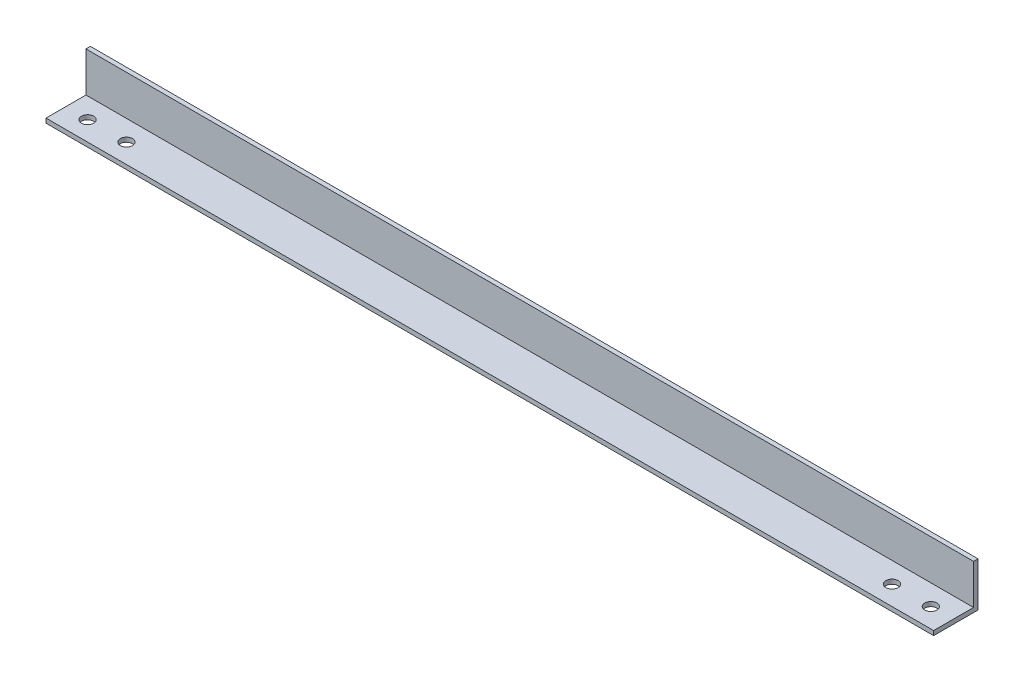
ISO-10303-21;
HEADER;
FILE_DESCRIPTION(('STEP AP214'),'2;1');
FILE_NAME('part.step','',(''),(''),'','','');
FILE_SCHEMA(('AUTOMOTIVE_DESIGN { 1 0 10303 214 1 1 1 1 }'));
ENDSEC;
DATA;
#1=APPLICATION_CONTEXT('core data for automotive mechanical design processes');
#2=APPLICATION_PROTOCOL_DEFINITION('international standard','automotive_design',2000,#1);
#3=PRODUCT_CONTEXT('',#1,'mechanical');
#4=PRODUCT('Part','Part','',(#3));
#5=PRODUCT_RELATED_PRODUCT_CATEGORY('part','',(#4));
#6=PRODUCT_DEFINITION_FORMATION('','',#4);
#7=PRODUCT_DEFINITION_CONTEXT('part definition',#1,'design');
#8=PRODUCT_DEFINITION('design','',#6,#7);
#9=PRODUCT_DEFINITION_SHAPE('','',#8);
#10=(LENGTH_UNIT() NAMED_UNIT(*) SI_UNIT(.MILLI.,.METRE.));
#11=(NAMED_UNIT(*) PLANE_ANGLE_UNIT() SI_UNIT($,.RADIAN.));
#12=(NAMED_UNIT(*) SI_UNIT($,.STERADIAN.) SOLID_ANGLE_UNIT());
#13=UNCERTAINTY_MEASURE_WITH_UNIT(LENGTH_MEASURE(1.E-05),#10,'distance_accuracy_value','');
#14=(GEOMETRIC_REPRESENTATION_CONTEXT(3) GLOBAL_UNCERTAINTY_ASSIGNED_CONTEXT((#13)) GLOBAL_UNIT_ASSIGNED_CONTEXT((#10,
#11,#12)) REPRESENTATION_CONTEXT('',''));
#15=CARTESIAN_POINT('',(0.,0.,0.));
#16=DIRECTION('',(0.,0.,1.));
#17=DIRECTION('',(1.,0.,0.));
#18=AXIS2_PLACEMENT_3D('',#15,#16,#17);
#19=CARTESIAN_POINT('',(0.,80.,8.));
#20=DIRECTION('',(0.,0.,-1.));
#21=DIRECTION('',(-1.,0.,0.));
#22=AXIS2_PLACEMENT_3D('',#19,#20,#21);
#23=PLANE('',#22);
#24=DIRECTION('',(-1.,0.,0.));
#25=VECTOR('',#24,1.);
#26=CARTESIAN_POINT('',(0.,8.00000000000001,8.));
#27=LINE('',#26,#25);
#28=CARTESIAN_POINT('',(1600.,8.00000000000001,8.));
#29=VERTEX_POINT('',#28);
#30=CARTESIAN_POINT('',(0.,8.00000000000001,8.));
#31=VERTEX_POINT('',#30);
#32=EDGE_CURVE('E52',#29,#31,#27,.T.);
#33=ORIENTED_EDGE('',*,*,#32,.F.);
#34=DIRECTION('',(0.,1.,0.));
#35=VECTOR('',#34,1.);
#36=CARTESIAN_POINT('',(1600.,0.,8.));
#37=LINE('',#36,#35);
#38=CARTESIAN_POINT('',(1600.,80.,8.));
#39=VERTEX_POINT('',#38);
#40=EDGE_CURVE('E112',#29,#39,#37,.T.);
#41=ORIENTED_EDGE('',*,*,#40,.T.);
#42=DIRECTION('',(-1.,0.,0.));
#43=VECTOR('',#42,1.);
#44=CARTESIAN_POINT('',(0.,80.,8.));
#45=LINE('',#44,#43);
#46=CARTESIAN_POINT('',(0.,80.,8.));
#47=VERTEX_POINT('',#46);
#48=EDGE_CURVE('E58',#39,#47,#45,.T.);
#49=ORIENTED_EDGE('',*,*,#48,.T.);
#50=DIRECTION('',(0.,-1.,0.));
#51=VECTOR('',#50,1.);
#52=CARTESIAN_POINT('',(0.,0.,8.));
#53=LINE('',#52,#51);
#54=EDGE_CURVE('E87',#47,#31,#53,.T.);
#55=ORIENTED_EDGE('',*,*,#54,.T.);
#56=EDGE_LOOP('',(#33,#41,#49,#55));
#57=FACE_BOUND('',#56,.T.);
#58=ADVANCED_FACE('F35',(#57),#23,.F.);
#59=CARTESIAN_POINT('',(0.,0.,8.));
#60=DIRECTION('',(1.,0.,0.));
#61=DIRECTION('',(0.,0.,-1.));
#62=AXIS2_PLACEMENT_3D('',#59,#60,#61);
#63=PLANE('',#62);
#64=DIRECTION('',(0.,-1.,0.));
#65=VECTOR('',#64,1.);
#66=CARTESIAN_POINT('',(0.,0.,0.));
#67=LINE('',#66,#65);
#68=CARTESIAN_POINT('',(0.,80.,0.));
#69=VERTEX_POINT('',#68);
#70=CARTESIAN_POINT('',(0.,0.,0.));
#71=VERTEX_POINT('',#70);
#72=EDGE_CURVE('E93',#69,#71,#67,.T.);
#73=ORIENTED_EDGE('',*,*,#72,.T.);
#74=DIRECTION('',(0.,0.,-1.));
#75=VECTOR('',#74,1.);
#76=CARTESIAN_POINT('',(0.,0.,8.));
#77=LINE('',#76,#75);
#78=CARTESIAN_POINT('',(0.,0.,80.));
#79=VERTEX_POINT('',#78);
#80=EDGE_CURVE('E11',#79,#71,#77,.T.);
#81=ORIENTED_EDGE('',*,*,#80,.F.);
#82=DIRECTION('',(0.,-1.,0.));
#83=VECTOR('',#82,1.);
#84=CARTESIAN_POINT('',(0.,0.,80.));
#85=LINE('',#84,#83);
#86=CARTESIAN_POINT('',(0.,8.00000000000001,80.));
#87=VERTEX_POINT('',#86);
#88=EDGE_CURVE('E122',#87,#79,#85,.T.);
#89=ORIENTED_EDGE('',*,*,#88,.F.);
#90=DIRECTION('',(0.,0.,-1.));
#91=VECTOR('',#90,1.);
#92=CARTESIAN_POINT('',(0.,8.00000000000001,80.));
#93=LINE('',#92,#91);
#94=EDGE_CURVE('E102',#87,#31,#93,.T.);
#95=ORIENTED_EDGE('',*,*,#94,.T.);
#96=ORIENTED_EDGE('',*,*,#54,.F.);
#97=DIRECTION('',(0.,0.,-1.));
#98=VECTOR('',#97,1.);
#99=CARTESIAN_POINT('',(0.,80.,8.));
#100=LINE('',#99,#98);
#101=EDGE_CURVE('E80',#47,#69,#100,.T.);
#102=ORIENTED_EDGE('',*,*,#101,.T.);
#103=EDGE_LOOP('',(#73,#81,#89,#95,#96,#102));
#104=FACE_BOUND('',#103,.T.);
#105=ADVANCED_FACE('F37',(#104),#63,.F.);
#106=CARTESIAN_POINT('',(0.,0.,8.));
#107=DIRECTION('',(0.,1.,0.));
#108=DIRECTION('',(0.,0.,1.));
#109=AXIS2_PLACEMENT_3D('',#106,#107,#108);
#110=PLANE('',#109);
#111=CARTESIAN_POINT('',(1560.,0.,45.0000000000001));
#112=DIRECTION('',(0.,1.,0.));
#113=DIRECTION('',(0.,0.,1.));
#114=AXIS2_PLACEMENT_3D('',#111,#112,#113);
#115=CIRCLE('',#114,10.9999999999999);
#116=CARTESIAN_POINT('',(1560.,0.,56.));
#117=VERTEX_POINT('',#116);
#118=EDGE_CURVE('E158',#117,#117,#115,.T.);
#119=ORIENTED_EDGE('',*,*,#118,.T.);
#120=EDGE_LOOP('',(#119));
#121=FACE_BOUND('',#120,.T.);
#122=CARTESIAN_POINT('',(1490.,0.,45.0000000000001));
#123=DIRECTION('',(0.,1.,0.));
#124=DIRECTION('',(0.,0.,1.));
#125=AXIS2_PLACEMENT_3D('',#122,#123,#124);
#126=CIRCLE('',#125,10.9999999999999);
#127=CARTESIAN_POINT('',(1490.,0.,56.0000000000001));
#128=VERTEX_POINT('',#127);
#129=EDGE_CURVE('E152',#128,#128,#126,.T.);
#130=ORIENTED_EDGE('',*,*,#129,.T.);
#131=EDGE_LOOP('',(#130));
#132=FACE_BOUND('',#131,.T.);
#133=CARTESIAN_POINT('',(110.,0.,45.0000000000001));
#134=DIRECTION('',(0.,1.,0.));
#135=DIRECTION('',(0.,0.,1.));
#136=AXIS2_PLACEMENT_3D('',#133,#134,#135);
#137=CIRCLE('',#136,11.);
#138=CARTESIAN_POINT('',(110.,0.,56.0000000000002));
#139=VERTEX_POINT('',#138);
#140=EDGE_CURVE('E146',#139,#139,#137,.T.);
#141=ORIENTED_EDGE('',*,*,#140,.T.);
#142=EDGE_LOOP('',(#141));
#143=FACE_BOUND('',#142,.T.);
#144=CARTESIAN_POINT('',(40.0000000000001,0.,45.0000000000001));
#145=DIRECTION('',(0.,1.,0.));
#146=DIRECTION('',(0.,0.,1.));
#147=AXIS2_PLACEMENT_3D('',#144,#145,#146);
#148=CIRCLE('',#147,11.);
#149=CARTESIAN_POINT('',(40.0000000000001,0.,56.0000000000001));
#150=VERTEX_POINT('',#149);
#151=EDGE_CURVE('E123',#150,#150,#148,.T.);
#152=ORIENTED_EDGE('',*,*,#151,.T.);
#153=EDGE_LOOP('',(#152));
#154=FACE_BOUND('',#153,.T.);
#155=DIRECTION('',(1.,0.,0.));
#156=VECTOR('',#155,1.);
#157=CARTESIAN_POINT('',(0.,0.,0.));
#158=LINE('',#157,#156);
#159=CARTESIAN_POINT('',(1600.,0.,0.));
#160=VERTEX_POINT('',#159);
#161=EDGE_CURVE('E97',#71,#160,#158,.T.);
#162=ORIENTED_EDGE('',*,*,#161,.T.);
#163=DIRECTION('',(0.,0.,-1.));
#164=VECTOR('',#163,1.);
#165=CARTESIAN_POINT('',(1600.,0.,8.));
#166=LINE('',#165,#164);
#167=CARTESIAN_POINT('',(1600.,0.,80.));
#168=VERTEX_POINT('',#167);
#169=EDGE_CURVE('E44',#168,#160,#166,.T.);
#170=ORIENTED_EDGE('',*,*,#169,.F.);
#171=DIRECTION('',(1.,0.,0.));
#172=VECTOR('',#171,1.);
#173=CARTESIAN_POINT('',(0.,0.,80.));
#174=LINE('',#173,#172);
#175=EDGE_CURVE('E135',#79,#168,#174,.T.);
#176=ORIENTED_EDGE('',*,*,#175,.F.);
#177=ORIENTED_EDGE('',*,*,#80,.T.);
#178=EDGE_LOOP('',(#162,#170,#176,#177));
#179=FACE_BOUND('',#178,.T.);
#180=ADVANCED_FACE('F167',(#121,#132,#143,#154,#179),#110,.F.);
#181=CARTESIAN_POINT('',(1600.,0.,8.));
#182=DIRECTION('',(-1.,0.,0.));
#183=DIRECTION('',(0.,0.,1.));
#184=AXIS2_PLACEMENT_3D('',#181,#182,#183);
#185=PLANE('',#184);
#186=DIRECTION('',(0.,1.,0.));
#187=VECTOR('',#186,1.);
#188=CARTESIAN_POINT('',(1600.,0.,0.));
#189=LINE('',#188,#187);
#190=CARTESIAN_POINT('',(1600.,80.,0.));
#191=VERTEX_POINT('',#190);
#192=EDGE_CURVE('E88',#160,#191,#189,.T.);
#193=ORIENTED_EDGE('',*,*,#192,.T.);
#194=DIRECTION('',(0.,0.,-1.));
#195=VECTOR('',#194,1.);
#196=CARTESIAN_POINT('',(1600.,80.,8.));
#197=LINE('',#196,#195);
#198=EDGE_CURVE('E83',#39,#191,#197,.T.);
#199=ORIENTED_EDGE('',*,*,#198,.F.);
#200=ORIENTED_EDGE('',*,*,#40,.F.);
#201=DIRECTION('',(0.,0.,-1.));
#202=VECTOR('',#201,1.);
#203=CARTESIAN_POINT('',(1600.,8.00000000000001,80.));
#204=LINE('',#203,#202);
#205=CARTESIAN_POINT('',(1600.,8.00000000000001,80.));
#206=VERTEX_POINT('',#205);
#207=EDGE_CURVE('E98',#206,#29,#204,.T.);
#208=ORIENTED_EDGE('',*,*,#207,.F.);
#209=DIRECTION('',(0.,1.,0.));
#210=VECTOR('',#209,1.);
#211=CARTESIAN_POINT('',(1600.,0.,80.));
#212=LINE('',#211,#210);
#213=EDGE_CURVE('E130',#168,#206,#212,.T.);
#214=ORIENTED_EDGE('',*,*,#213,.F.);
#215=ORIENTED_EDGE('',*,*,#169,.T.);
#216=EDGE_LOOP('',(#193,#199,#200,#208,#214,#215));
#217=FACE_BOUND('',#216,.T.);
#218=ADVANCED_FACE('F198',(#217),#185,.F.);
#219=CARTESIAN_POINT('',(0.,80.,8.));
#220=DIRECTION('',(0.,-1.,0.));
#221=DIRECTION('',(0.,0.,-1.));
#222=AXIS2_PLACEMENT_3D('',#219,#220,#221);
#223=PLANE('',#222);
#224=DIRECTION('',(-1.,0.,0.));
#225=VECTOR('',#224,1.);
#226=CARTESIAN_POINT('',(0.,80.,0.));
#227=LINE('',#226,#225);
#228=EDGE_CURVE('E77',#191,#69,#227,.T.);
#229=ORIENTED_EDGE('',*,*,#228,.T.);
#230=ORIENTED_EDGE('',*,*,#101,.F.);
#231=ORIENTED_EDGE('',*,*,#48,.F.);
#232=ORIENTED_EDGE('',*,*,#198,.T.);
#233=EDGE_LOOP('',(#229,#230,#231,#232));
#234=FACE_BOUND('',#233,.T.);
#235=ADVANCED_FACE('F79',(#234),#223,.F.);
#236=CARTESIAN_POINT('',(0.,80.,0.));
#237=DIRECTION('',(0.,0.,-1.));
#238=DIRECTION('',(-1.,0.,0.));
#239=AXIS2_PLACEMENT_3D('',#236,#237,#238);
#240=PLANE('',#239);
#241=ORIENTED_EDGE('',*,*,#72,.F.);
#242=ORIENTED_EDGE('',*,*,#228,.F.);
#243=ORIENTED_EDGE('',*,*,#192,.F.);
#244=ORIENTED_EDGE('',*,*,#161,.F.);
#245=EDGE_LOOP('',(#241,#242,#243,#244));
#246=FACE_BOUND('',#245,.T.);
#247=ADVANCED_FACE('F96',(#246),#240,.T.);
#248=CARTESIAN_POINT('',(0.,8.00000000000001,80.));
#249=DIRECTION('',(0.,-1.,0.));
#250=DIRECTION('',(0.,0.,-1.));
#251=AXIS2_PLACEMENT_3D('',#248,#249,#250);
#252=PLANE('',#251);
#253=CARTESIAN_POINT('',(1560.,8.00000000000001,45.0000000000001));
#254=DIRECTION('',(0.,1.,0.));
#255=DIRECTION('',(0.,0.,1.));
#256=AXIS2_PLACEMENT_3D('',#253,#254,#255);
#257=CIRCLE('',#256,10.9999999999999);
#258=CARTESIAN_POINT('',(1560.,8.00000000000001,56.));
#259=VERTEX_POINT('',#258);
#260=EDGE_CURVE('E161',#259,#259,#257,.T.);
#261=ORIENTED_EDGE('',*,*,#260,.F.);
#262=EDGE_LOOP('',(#261));
#263=FACE_BOUND('',#262,.T.);
#264=CARTESIAN_POINT('',(1490.,8.00000000000001,45.0000000000001));
#265=DIRECTION('',(0.,1.,0.));
#266=DIRECTION('',(0.,0.,1.));
#267=AXIS2_PLACEMENT_3D('',#264,#265,#266);
#268=CIRCLE('',#267,10.9999999999999);
#269=CARTESIAN_POINT('',(1490.,8.00000000000001,56.0000000000001));
#270=VERTEX_POINT('',#269);
#271=EDGE_CURVE('E155',#270,#270,#268,.T.);
#272=ORIENTED_EDGE('',*,*,#271,.F.);
#273=EDGE_LOOP('',(#272));
#274=FACE_BOUND('',#273,.T.);
#275=CARTESIAN_POINT('',(110.,8.00000000000001,45.0000000000001));
#276=DIRECTION('',(0.,1.,0.));
#277=DIRECTION('',(0.,0.,1.));
#278=AXIS2_PLACEMENT_3D('',#275,#276,#277);
#279=CIRCLE('',#278,11.);
#280=CARTESIAN_POINT('',(110.,8.00000000000001,56.0000000000002));
#281=VERTEX_POINT('',#280);
#282=EDGE_CURVE('E149',#281,#281,#279,.T.);
#283=ORIENTED_EDGE('',*,*,#282,.F.);
#284=EDGE_LOOP('',(#283));
#285=FACE_BOUND('',#284,.T.);
#286=CARTESIAN_POINT('',(40.0000000000001,8.00000000000001,45.0000000000001));
#287=DIRECTION('',(0.,1.,0.));
#288=DIRECTION('',(0.,0.,1.));
#289=AXIS2_PLACEMENT_3D('',#286,#287,#288);
#290=CIRCLE('',#289,11.);
#291=CARTESIAN_POINT('',(40.0000000000001,8.00000000000001,56.0000000000001));
#292=VERTEX_POINT('',#291);
#293=EDGE_CURVE('E143',#292,#292,#290,.T.);
#294=ORIENTED_EDGE('',*,*,#293,.F.);
#295=EDGE_LOOP('',(#294));
#296=FACE_BOUND('',#295,.T.);
#297=ORIENTED_EDGE('',*,*,#32,.T.);
#298=ORIENTED_EDGE('',*,*,#94,.F.);
#299=DIRECTION('',(-1.,0.,0.));
#300=VECTOR('',#299,1.);
#301=CARTESIAN_POINT('',(0.,8.00000000000001,80.));
#302=LINE('',#301,#300);
#303=EDGE_CURVE('E119',#206,#87,#302,.T.);
#304=ORIENTED_EDGE('',*,*,#303,.F.);
#305=ORIENTED_EDGE('',*,*,#207,.T.);
#306=EDGE_LOOP('',(#297,#298,#304,#305));
#307=FACE_BOUND('',#306,.T.);
#308=ADVANCED_FACE('F177',(#263,#274,#285,#296,#307),#252,.F.);
#309=CARTESIAN_POINT('',(0.,8.00000000000001,80.));
#310=DIRECTION('',(0.,0.,-1.));
#311=DIRECTION('',(-1.,0.,0.));
#312=AXIS2_PLACEMENT_3D('',#309,#310,#311);
#313=PLANE('',#312);
#314=ORIENTED_EDGE('',*,*,#88,.T.);
#315=ORIENTED_EDGE('',*,*,#175,.T.);
#316=ORIENTED_EDGE('',*,*,#213,.T.);
#317=ORIENTED_EDGE('',*,*,#303,.T.);
#318=EDGE_LOOP('',(#314,#315,#316,#317));
#319=FACE_BOUND('',#318,.T.);
#320=ADVANCED_FACE('F180',(#319),#313,.F.);
#321=CARTESIAN_POINT('',(40.0000000000001,0.,45.0000000000001));
#322=DIRECTION('',(0.,1.,0.));
#323=DIRECTION('',(0.,0.,1.));
#324=AXIS2_PLACEMENT_3D('',#321,#322,#323);
#325=CYLINDRICAL_SURFACE('',#324,11.);
#326=ORIENTED_EDGE('',*,*,#151,.F.);
#327=EDGE_LOOP('',(#326));
#328=FACE_BOUND('',#327,.T.);
#329=ORIENTED_EDGE('',*,*,#293,.T.);
#330=EDGE_LOOP('',(#329));
#331=FACE_BOUND('',#330,.T.);
#332=ADVANCED_FACE('F239',(#328,#331),#325,.F.);
#333=CARTESIAN_POINT('',(110.,0.,45.0000000000001));
#334=DIRECTION('',(0.,1.,0.));
#335=DIRECTION('',(0.,0.,1.));
#336=AXIS2_PLACEMENT_3D('',#333,#334,#335);
#337=CYLINDRICAL_SURFACE('',#336,11.);
#338=ORIENTED_EDGE('',*,*,#140,.F.);
#339=EDGE_LOOP('',(#338));
#340=FACE_BOUND('',#339,.T.);
#341=ORIENTED_EDGE('',*,*,#282,.T.);
#342=EDGE_LOOP('',(#341));
#343=FACE_BOUND('',#342,.T.);
#344=ADVANCED_FACE('F244',(#340,#343),#337,.F.);
#345=CARTESIAN_POINT('',(1490.,0.,45.0000000000001));
#346=DIRECTION('',(0.,1.,0.));
#347=DIRECTION('',(0.,0.,1.));
#348=AXIS2_PLACEMENT_3D('',#345,#346,#347);
#349=CYLINDRICAL_SURFACE('',#348,10.9999999999999);
#350=ORIENTED_EDGE('',*,*,#129,.F.);
#351=EDGE_LOOP('',(#350));
#352=FACE_BOUND('',#351,.T.);
#353=ORIENTED_EDGE('',*,*,#271,.T.);
#354=EDGE_LOOP('',(#353));
#355=FACE_BOUND('',#354,.T.);
#356=ADVANCED_FACE('F173',(#352,#355),#349,.F.);
#357=CARTESIAN_POINT('',(1560.,0.,45.0000000000001));
#358=DIRECTION('',(0.,1.,0.));
#359=DIRECTION('',(0.,0.,1.));
#360=AXIS2_PLACEMENT_3D('',#357,#358,#359);
#361=CYLINDRICAL_SURFACE('',#360,10.9999999999999);
#362=ORIENTED_EDGE('',*,*,#118,.F.);
#363=EDGE_LOOP('',(#362));
#364=FACE_BOUND('',#363,.T.);
#365=ORIENTED_EDGE('',*,*,#260,.T.);
#366=EDGE_LOOP('',(#365));
#367=FACE_BOUND('',#366,.T.);
#368=ADVANCED_FACE('F170',(#364,#367),#361,.F.);
#369=CLOSED_SHELL('',(#58,#105,#180,#218,#235,#247,#308,#320,#332,#344,#356,#368));
#370=MANIFOLD_SOLID_BREP('B2',#369);
#371=ADVANCED_BREP_SHAPE_REPRESENTATION('',(#18,#370),#14);
#372=SHAPE_DEFINITION_REPRESENTATION(#9,#371);
ENDSEC;
END-ISO-10303-21;
